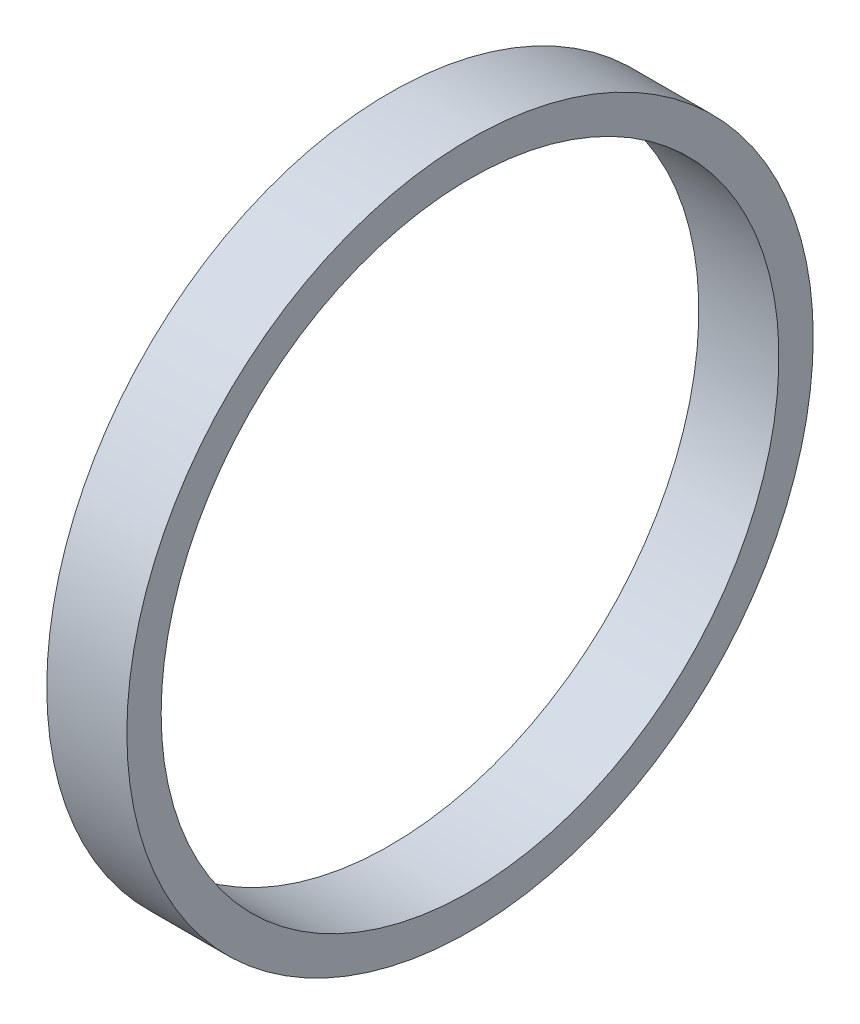
ISO-10303-21;
HEADER;
FILE_DESCRIPTION(('STEP AP214'),'2;1');
FILE_NAME('part.step','',(''),(''),'','','');
FILE_SCHEMA(('AUTOMOTIVE_DESIGN { 1 0 10303 214 1 1 1 1 }'));
ENDSEC;
DATA;
#1=APPLICATION_CONTEXT('core data for automotive mechanical design processes');
#2=APPLICATION_PROTOCOL_DEFINITION('international standard','automotive_design',2000,#1);
#3=PRODUCT_CONTEXT('',#1,'mechanical');
#4=PRODUCT('Part','Part','',(#3));
#5=PRODUCT_RELATED_PRODUCT_CATEGORY('part','',(#4));
#6=PRODUCT_DEFINITION_FORMATION('','',#4);
#7=PRODUCT_DEFINITION_CONTEXT('part definition',#1,'design');
#8=PRODUCT_DEFINITION('design','',#6,#7);
#9=PRODUCT_DEFINITION_SHAPE('','',#8);
#10=(LENGTH_UNIT() NAMED_UNIT(*) SI_UNIT(.MILLI.,.METRE.));
#11=(NAMED_UNIT(*) PLANE_ANGLE_UNIT() SI_UNIT($,.RADIAN.));
#12=(NAMED_UNIT(*) SI_UNIT($,.STERADIAN.) SOLID_ANGLE_UNIT());
#13=UNCERTAINTY_MEASURE_WITH_UNIT(LENGTH_MEASURE(1.E-05),#10,'distance_accuracy_value','');
#14=(GEOMETRIC_REPRESENTATION_CONTEXT(3) GLOBAL_UNCERTAINTY_ASSIGNED_CONTEXT((#13)) GLOBAL_UNIT_ASSIGNED_CONTEXT((#10,
#11,#12)) REPRESENTATION_CONTEXT('',''));
#15=CARTESIAN_POINT('',(0.,0.,0.));
#16=DIRECTION('',(0.,0.,1.));
#17=DIRECTION('',(1.,0.,0.));
#18=AXIS2_PLACEMENT_3D('',#15,#16,#17);
#19=CARTESIAN_POINT('',(0.,30.,0.));
#20=DIRECTION('',(1.,0.,0.));
#21=DIRECTION('',(0.,0.,-1.));
#22=AXIS2_PLACEMENT_3D('',#19,#20,#21);
#23=PLANE('',#22);
#24=CARTESIAN_POINT('',(0.,0.,0.));
#25=DIRECTION('',(-1.,0.,0.));
#26=DIRECTION('',(0.,0.,1.));
#27=AXIS2_PLACEMENT_3D('',#24,#25,#26);
#28=CIRCLE('',#27,27.);
#29=CARTESIAN_POINT('',(0.,0.,27.));
#30=VERTEX_POINT('',#29);
#31=EDGE_CURVE('E10',#30,#30,#28,.T.);
#32=ORIENTED_EDGE('',*,*,#31,.F.);
#33=EDGE_LOOP('',(#32));
#34=FACE_BOUND('',#33,.T.);
#35=CARTESIAN_POINT('',(0.,0.,0.));
#36=DIRECTION('',(-1.,0.,0.));
#37=DIRECTION('',(0.,0.,1.));
#38=AXIS2_PLACEMENT_3D('',#35,#36,#37);
#39=CIRCLE('',#38,30.);
#40=CARTESIAN_POINT('',(0.,0.,30.));
#41=VERTEX_POINT('',#40);
#42=EDGE_CURVE('E51',#41,#41,#39,.T.);
#43=ORIENTED_EDGE('',*,*,#42,.T.);
#44=EDGE_LOOP('',(#43));
#45=FACE_BOUND('',#44,.T.);
#46=ADVANCED_FACE('F37',(#34,#45),#23,.F.);
#47=CARTESIAN_POINT('',(0.,0.,0.));
#48=DIRECTION('',(-1.,0.,0.));
#49=DIRECTION('',(0.,0.,1.));
#50=AXIS2_PLACEMENT_3D('',#47,#48,#49);
#51=CYLINDRICAL_SURFACE('',#50,27.);
#52=CARTESIAN_POINT('',(7.,0.,0.));
#53=DIRECTION('',(-1.,0.,0.));
#54=DIRECTION('',(0.,0.,1.));
#55=AXIS2_PLACEMENT_3D('',#52,#53,#54);
#56=CIRCLE('',#55,27.);
#57=CARTESIAN_POINT('',(7.,0.,27.));
#58=VERTEX_POINT('',#57);
#59=EDGE_CURVE('E43',#58,#58,#56,.T.);
#60=ORIENTED_EDGE('',*,*,#59,.F.);
#61=EDGE_LOOP('',(#60));
#62=FACE_BOUND('',#61,.T.);
#63=ORIENTED_EDGE('',*,*,#31,.T.);
#64=EDGE_LOOP('',(#63));
#65=FACE_BOUND('',#64,.T.);
#66=ADVANCED_FACE('F66',(#62,#65),#51,.F.);
#67=CARTESIAN_POINT('',(7.,27.,0.));
#68=DIRECTION('',(-1.,0.,0.));
#69=DIRECTION('',(0.,0.,1.));
#70=AXIS2_PLACEMENT_3D('',#67,#68,#69);
#71=PLANE('',#70);
#72=CARTESIAN_POINT('',(7.,0.,0.));
#73=DIRECTION('',(-1.,0.,0.));
#74=DIRECTION('',(0.,0.,1.));
#75=AXIS2_PLACEMENT_3D('',#72,#73,#74);
#76=CIRCLE('',#75,30.);
#77=CARTESIAN_POINT('',(7.,0.,30.));
#78=VERTEX_POINT('',#77);
#79=EDGE_CURVE('E47',#78,#78,#76,.T.);
#80=ORIENTED_EDGE('',*,*,#79,.F.);
#81=EDGE_LOOP('',(#80));
#82=FACE_BOUND('',#81,.T.);
#83=ORIENTED_EDGE('',*,*,#59,.T.);
#84=EDGE_LOOP('',(#83));
#85=FACE_BOUND('',#84,.T.);
#86=ADVANCED_FACE('F61',(#82,#85),#71,.F.);
#87=CARTESIAN_POINT('',(0.,0.,0.));
#88=DIRECTION('',(-1.,0.,0.));
#89=DIRECTION('',(0.,0.,1.));
#90=AXIS2_PLACEMENT_3D('',#87,#88,#89);
#91=CYLINDRICAL_SURFACE('',#90,30.);
#92=ORIENTED_EDGE('',*,*,#42,.F.);
#93=EDGE_LOOP('',(#92));
#94=FACE_BOUND('',#93,.T.);
#95=ORIENTED_EDGE('',*,*,#79,.T.);
#96=EDGE_LOOP('',(#95));
#97=FACE_BOUND('',#96,.T.);
#98=ADVANCED_FACE('F58',(#94,#97),#91,.T.);
#99=CLOSED_SHELL('',(#46,#66,#86,#98));
#100=MANIFOLD_SOLID_BREP('B2',#99);
#101=ADVANCED_BREP_SHAPE_REPRESENTATION('',(#18,#100),#14);
#102=SHAPE_DEFINITION_REPRESENTATION(#9,#101);
ENDSEC;
END-ISO-10303-21;
